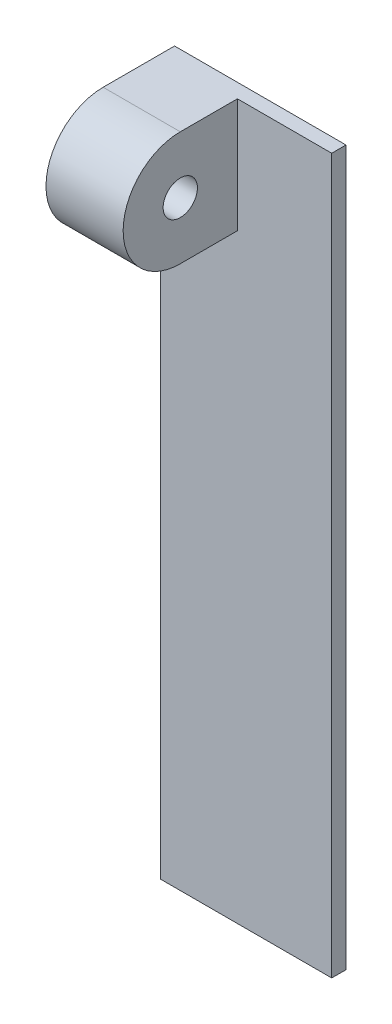
ISO-10303-21;
HEADER;
FILE_DESCRIPTION(('STEP AP214'),'2;1');
FILE_NAME('part.step','',(''),(''),'','','');
FILE_SCHEMA(('AUTOMOTIVE_DESIGN { 1 0 10303 214 1 1 1 1 }'));
ENDSEC;
DATA;
#1=APPLICATION_CONTEXT('core data for automotive mechanical design processes');
#2=APPLICATION_PROTOCOL_DEFINITION('international standard','automotive_design',2000,#1);
#3=PRODUCT_CONTEXT('',#1,'mechanical');
#4=PRODUCT('Part','Part','',(#3));
#5=PRODUCT_RELATED_PRODUCT_CATEGORY('part','',(#4));
#6=PRODUCT_DEFINITION_FORMATION('','',#4);
#7=PRODUCT_DEFINITION_CONTEXT('part definition',#1,'design');
#8=PRODUCT_DEFINITION('design','',#6,#7);
#9=PRODUCT_DEFINITION_SHAPE('','',#8);
#10=(LENGTH_UNIT() NAMED_UNIT(*) SI_UNIT(.MILLI.,.METRE.));
#11=(NAMED_UNIT(*) PLANE_ANGLE_UNIT() SI_UNIT($,.RADIAN.));
#12=(NAMED_UNIT(*) SI_UNIT($,.STERADIAN.) SOLID_ANGLE_UNIT());
#13=UNCERTAINTY_MEASURE_WITH_UNIT(LENGTH_MEASURE(1.E-05),#10,'distance_accuracy_value','');
#14=(GEOMETRIC_REPRESENTATION_CONTEXT(3) GLOBAL_UNCERTAINTY_ASSIGNED_CONTEXT((#13)) GLOBAL_UNIT_ASSIGNED_CONTEXT((#10,
#11,#12)) REPRESENTATION_CONTEXT('',''));
#15=CARTESIAN_POINT('',(0.,0.,0.));
#16=DIRECTION('',(0.,0.,1.));
#17=DIRECTION('',(1.,0.,0.));
#18=AXIS2_PLACEMENT_3D('',#15,#16,#17);
#19=CARTESIAN_POINT('',(0.,0.,5.));
#20=DIRECTION('',(0.,0.,1.));
#21=DIRECTION('',(1.,0.,0.));
#22=AXIS2_PLACEMENT_3D('',#19,#20,#21);
#23=PLANE('',#22);
#24=DIRECTION('',(-1.,0.,0.));
#25=VECTOR('',#24,1.);
#26=CARTESIAN_POINT('',(30.,125.,5.));
#27=LINE('',#26,#25);
#28=CARTESIAN_POINT('',(30.,125.,5.));
#29=VERTEX_POINT('',#28);
#30=CARTESIAN_POINT('',(-3.00000000000001,125.,5.));
#31=VERTEX_POINT('',#30);
#32=EDGE_CURVE('E121',#29,#31,#27,.T.);
#33=ORIENTED_EDGE('',*,*,#32,.T.);
#34=DIRECTION('',(0.,-1.,0.));
#35=VECTOR('',#34,1.);
#36=CARTESIAN_POINT('',(-3.00000000000001,125.,5.));
#37=LINE('',#36,#35);
#38=CARTESIAN_POINT('',(-3.00000000000001,85.,5.));
#39=VERTEX_POINT('',#38);
#40=EDGE_CURVE('E109',#31,#39,#37,.T.);
#41=ORIENTED_EDGE('',*,*,#40,.T.);
#42=DIRECTION('',(-1.,0.,0.));
#43=VECTOR('',#42,1.);
#44=CARTESIAN_POINT('',(-3.00000000000001,85.,5.));
#45=LINE('',#44,#43);
#46=CARTESIAN_POINT('',(-30.,85.,5.));
#47=VERTEX_POINT('',#46);
#48=EDGE_CURVE('E172',#39,#47,#45,.T.);
#49=ORIENTED_EDGE('',*,*,#48,.T.);
#50=DIRECTION('',(0.,-1.,0.));
#51=VECTOR('',#50,1.);
#52=CARTESIAN_POINT('',(-30.,-125.,5.));
#53=LINE('',#52,#51);
#54=CARTESIAN_POINT('',(-30.,-125.,5.));
#55=VERTEX_POINT('',#54);
#56=EDGE_CURVE('E89',#47,#55,#53,.T.);
#57=ORIENTED_EDGE('',*,*,#56,.T.);
#58=DIRECTION('',(1.,0.,0.));
#59=VECTOR('',#58,1.);
#60=CARTESIAN_POINT('',(30.,-125.,5.));
#61=LINE('',#60,#59);
#62=CARTESIAN_POINT('',(30.,-125.,5.));
#63=VERTEX_POINT('',#62);
#64=EDGE_CURVE('E134',#55,#63,#61,.T.);
#65=ORIENTED_EDGE('',*,*,#64,.T.);
#66=DIRECTION('',(0.,1.,0.));
#67=VECTOR('',#66,1.);
#68=CARTESIAN_POINT('',(30.,-125.,5.));
#69=LINE('',#68,#67);
#70=EDGE_CURVE('E64',#63,#29,#69,.T.);
#71=ORIENTED_EDGE('',*,*,#70,.T.);
#72=EDGE_LOOP('',(#33,#41,#49,#57,#65,#71));
#73=FACE_BOUND('',#72,.T.);
#74=ADVANCED_FACE('F39',(#73),#23,.T.);
#75=CARTESIAN_POINT('',(-30.,-125.,5.));
#76=DIRECTION('',(1.,0.,0.));
#77=DIRECTION('',(0.,0.,-1.));
#78=AXIS2_PLACEMENT_3D('',#75,#76,#77);
#79=PLANE('',#78);
#80=CARTESIAN_POINT('',(-30.,105.,25.));
#81=DIRECTION('',(1.,0.,0.));
#82=DIRECTION('',(0.,0.,-1.));
#83=AXIS2_PLACEMENT_3D('',#80,#81,#82);
#84=CIRCLE('',#83,6.);
#85=CARTESIAN_POINT('',(-30.,105.,19.));
#86=VERTEX_POINT('',#85);
#87=EDGE_CURVE('E274',#86,#86,#84,.T.);
#88=ORIENTED_EDGE('',*,*,#87,.T.);
#89=EDGE_LOOP('',(#88));
#90=FACE_BOUND('',#89,.T.);
#91=DIRECTION('',(0.,-1.,0.));
#92=VECTOR('',#91,1.);
#93=CARTESIAN_POINT('',(-30.,-125.,0.));
#94=LINE('',#93,#92);
#95=CARTESIAN_POINT('',(-30.,125.,0.));
#96=VERTEX_POINT('',#95);
#97=CARTESIAN_POINT('',(-30.,-125.,0.));
#98=VERTEX_POINT('',#97);
#99=EDGE_CURVE('E138',#96,#98,#94,.T.);
#100=ORIENTED_EDGE('',*,*,#99,.T.);
#101=DIRECTION('',(0.,0.,-1.));
#102=VECTOR('',#101,1.);
#103=CARTESIAN_POINT('',(-30.,-125.,5.));
#104=LINE('',#103,#102);
#105=EDGE_CURVE('E11',#55,#98,#104,.T.);
#106=ORIENTED_EDGE('',*,*,#105,.F.);
#107=ORIENTED_EDGE('',*,*,#56,.F.);
#108=DIRECTION('',(0.,0.,1.));
#109=VECTOR('',#108,1.);
#110=CARTESIAN_POINT('',(-30.,85.,5.));
#111=LINE('',#110,#109);
#112=CARTESIAN_POINT('',(-30.,85.,25.));
#113=VERTEX_POINT('',#112);
#114=EDGE_CURVE('E55',#47,#113,#111,.T.);
#115=ORIENTED_EDGE('',*,*,#114,.T.);
#116=CARTESIAN_POINT('',(-30.,105.,25.));
#117=DIRECTION('',(-1.,0.,0.));
#118=DIRECTION('',(0.,0.,-1.));
#119=AXIS2_PLACEMENT_3D('',#116,#117,#118);
#120=CIRCLE('',#119,20.);
#121=CARTESIAN_POINT('',(-30.,125.,25.));
#122=VERTEX_POINT('',#121);
#123=EDGE_CURVE('E125',#113,#122,#120,.T.);
#124=ORIENTED_EDGE('',*,*,#123,.T.);
#125=DIRECTION('',(0.,0.,-1.));
#126=VECTOR('',#125,1.);
#127=CARTESIAN_POINT('',(-30.,125.,5.));
#128=LINE('',#127,#126);
#129=EDGE_CURVE('E128',#122,#96,#128,.T.);
#130=ORIENTED_EDGE('',*,*,#129,.T.);
#131=EDGE_LOOP('',(#100,#106,#107,#115,#124,#130));
#132=FACE_BOUND('',#131,.T.);
#133=ADVANCED_FACE('F41',(#90,#132),#79,.F.);
#134=CARTESIAN_POINT('',(30.,-125.,5.));
#135=DIRECTION('',(0.,1.,0.));
#136=DIRECTION('',(-1.,0.,0.));
#137=AXIS2_PLACEMENT_3D('',#134,#135,#136);
#138=PLANE('',#137);
#139=DIRECTION('',(1.,0.,0.));
#140=VECTOR('',#139,1.);
#141=CARTESIAN_POINT('',(30.,-125.,0.));
#142=LINE('',#141,#140);
#143=CARTESIAN_POINT('',(30.,-125.,0.));
#144=VERTEX_POINT('',#143);
#145=EDGE_CURVE('E142',#98,#144,#142,.T.);
#146=ORIENTED_EDGE('',*,*,#145,.T.);
#147=DIRECTION('',(0.,0.,-1.));
#148=VECTOR('',#147,1.);
#149=CARTESIAN_POINT('',(30.,-125.,5.));
#150=LINE('',#149,#148);
#151=EDGE_CURVE('E48',#63,#144,#150,.T.);
#152=ORIENTED_EDGE('',*,*,#151,.F.);
#153=ORIENTED_EDGE('',*,*,#64,.F.);
#154=ORIENTED_EDGE('',*,*,#105,.T.);
#155=EDGE_LOOP('',(#146,#152,#153,#154));
#156=FACE_BOUND('',#155,.T.);
#157=ADVANCED_FACE('F181',(#156),#138,.F.);
#158=CARTESIAN_POINT('',(30.,-125.,5.));
#159=DIRECTION('',(-1.,0.,0.));
#160=DIRECTION('',(0.,0.,1.));
#161=AXIS2_PLACEMENT_3D('',#158,#159,#160);
#162=PLANE('',#161);
#163=DIRECTION('',(0.,1.,0.));
#164=VECTOR('',#163,1.);
#165=CARTESIAN_POINT('',(30.,-125.,0.));
#166=LINE('',#165,#164);
#167=CARTESIAN_POINT('',(30.,125.,0.));
#168=VERTEX_POINT('',#167);
#169=EDGE_CURVE('E145',#144,#168,#166,.T.);
#170=ORIENTED_EDGE('',*,*,#169,.T.);
#171=DIRECTION('',(0.,0.,-1.));
#172=VECTOR('',#171,1.);
#173=CARTESIAN_POINT('',(30.,125.,5.));
#174=LINE('',#173,#172);
#175=EDGE_CURVE('E132',#29,#168,#174,.T.);
#176=ORIENTED_EDGE('',*,*,#175,.F.);
#177=ORIENTED_EDGE('',*,*,#70,.F.);
#178=ORIENTED_EDGE('',*,*,#151,.T.);
#179=EDGE_LOOP('',(#170,#176,#177,#178));
#180=FACE_BOUND('',#179,.T.);
#181=ADVANCED_FACE('F156',(#180),#162,.F.);
#182=CARTESIAN_POINT('',(30.,125.,5.));
#183=DIRECTION('',(0.,-1.,0.));
#184=DIRECTION('',(0.,0.,-1.));
#185=AXIS2_PLACEMENT_3D('',#182,#183,#184);
#186=PLANE('',#185);
#187=DIRECTION('',(-1.,0.,0.));
#188=VECTOR('',#187,1.);
#189=CARTESIAN_POINT('',(30.,125.,0.));
#190=LINE('',#189,#188);
#191=EDGE_CURVE('E85',#168,#96,#190,.T.);
#192=ORIENTED_EDGE('',*,*,#191,.T.);
#193=ORIENTED_EDGE('',*,*,#129,.F.);
#194=DIRECTION('',(-1.,0.,0.));
#195=VECTOR('',#194,1.);
#196=CARTESIAN_POINT('',(-3.00000000000001,125.,25.));
#197=LINE('',#196,#195);
#198=CARTESIAN_POINT('',(-3.00000000000001,125.,25.));
#199=VERTEX_POINT('',#198);
#200=EDGE_CURVE('E123',#199,#122,#197,.T.);
#201=ORIENTED_EDGE('',*,*,#200,.F.);
#202=DIRECTION('',(0.,0.,-1.));
#203=VECTOR('',#202,1.);
#204=CARTESIAN_POINT('',(-3.00000000000001,125.,5.));
#205=LINE('',#204,#203);
#206=EDGE_CURVE('E113',#199,#31,#205,.T.);
#207=ORIENTED_EDGE('',*,*,#206,.T.);
#208=ORIENTED_EDGE('',*,*,#32,.F.);
#209=ORIENTED_EDGE('',*,*,#175,.T.);
#210=EDGE_LOOP('',(#192,#193,#201,#207,#208,#209));
#211=FACE_BOUND('',#210,.T.);
#212=ADVANCED_FACE('F120',(#211),#186,.F.);
#213=CARTESIAN_POINT('',(0.,0.,0.));
#214=DIRECTION('',(0.,0.,1.));
#215=DIRECTION('',(1.,0.,0.));
#216=AXIS2_PLACEMENT_3D('',#213,#214,#215);
#217=PLANE('',#216);
#218=ORIENTED_EDGE('',*,*,#99,.F.);
#219=ORIENTED_EDGE('',*,*,#191,.F.);
#220=ORIENTED_EDGE('',*,*,#169,.F.);
#221=ORIENTED_EDGE('',*,*,#145,.F.);
#222=EDGE_LOOP('',(#218,#219,#220,#221));
#223=FACE_BOUND('',#222,.T.);
#224=ADVANCED_FACE('F160',(#223),#217,.F.);
#225=CARTESIAN_POINT('',(-3.00000000000001,105.,25.));
#226=DIRECTION('',(-1.,0.,0.));
#227=DIRECTION('',(0.,0.,1.));
#228=AXIS2_PLACEMENT_3D('',#225,#226,#227);
#229=CYLINDRICAL_SURFACE('',#228,20.);
#230=ORIENTED_EDGE('',*,*,#123,.F.);
#231=DIRECTION('',(-1.,0.,0.));
#232=VECTOR('',#231,1.);
#233=CARTESIAN_POINT('',(-3.00000000000001,85.,25.));
#234=LINE('',#233,#232);
#235=CARTESIAN_POINT('',(-3.00000000000001,85.,25.));
#236=VERTEX_POINT('',#235);
#237=EDGE_CURVE('E169',#236,#113,#234,.T.);
#238=ORIENTED_EDGE('',*,*,#237,.F.);
#239=CARTESIAN_POINT('',(-3.00000000000001,105.,25.));
#240=DIRECTION('',(-1.,0.,0.));
#241=DIRECTION('',(0.,0.,-1.));
#242=AXIS2_PLACEMENT_3D('',#239,#240,#241);
#243=CIRCLE('',#242,20.);
#244=EDGE_CURVE('E167',#236,#199,#243,.T.);
#245=ORIENTED_EDGE('',*,*,#244,.T.);
#246=ORIENTED_EDGE('',*,*,#200,.T.);
#247=EDGE_LOOP('',(#230,#238,#245,#246));
#248=FACE_BOUND('',#247,.T.);
#249=ADVANCED_FACE('F166',(#248),#229,.T.);
#250=CARTESIAN_POINT('',(-3.00000000000001,85.,5.));
#251=DIRECTION('',(0.,-1.,0.));
#252=DIRECTION('',(0.,0.,-1.));
#253=AXIS2_PLACEMENT_3D('',#250,#251,#252);
#254=PLANE('',#253);
#255=ORIENTED_EDGE('',*,*,#114,.F.);
#256=ORIENTED_EDGE('',*,*,#48,.F.);
#257=DIRECTION('',(0.,0.,1.));
#258=VECTOR('',#257,1.);
#259=CARTESIAN_POINT('',(-3.00000000000001,85.,5.));
#260=LINE('',#259,#258);
#261=EDGE_CURVE('E116',#39,#236,#260,.T.);
#262=ORIENTED_EDGE('',*,*,#261,.T.);
#263=ORIENTED_EDGE('',*,*,#237,.T.);
#264=EDGE_LOOP('',(#255,#256,#262,#263));
#265=FACE_BOUND('',#264,.T.);
#266=ADVANCED_FACE('F195',(#265),#254,.T.);
#267=CARTESIAN_POINT('',(-3.00000000000001,105.,25.));
#268=DIRECTION('',(1.,0.,0.));
#269=DIRECTION('',(0.,0.,-1.));
#270=AXIS2_PLACEMENT_3D('',#267,#268,#269);
#271=PLANE('',#270);
#272=CARTESIAN_POINT('',(-3.00000000000001,105.,25.));
#273=DIRECTION('',(1.,0.,0.));
#274=DIRECTION('',(0.,0.,-1.));
#275=AXIS2_PLACEMENT_3D('',#272,#273,#274);
#276=CIRCLE('',#275,6.);
#277=CARTESIAN_POINT('',(-3.00000000000001,105.,19.));
#278=VERTEX_POINT('',#277);
#279=EDGE_CURVE('E277',#278,#278,#276,.T.);
#280=ORIENTED_EDGE('',*,*,#279,.F.);
#281=EDGE_LOOP('',(#280));
#282=FACE_BOUND('',#281,.T.);
#283=ORIENTED_EDGE('',*,*,#206,.F.);
#284=ORIENTED_EDGE('',*,*,#244,.F.);
#285=ORIENTED_EDGE('',*,*,#261,.F.);
#286=ORIENTED_EDGE('',*,*,#40,.F.);
#287=EDGE_LOOP('',(#283,#284,#285,#286));
#288=FACE_BOUND('',#287,.T.);
#289=ADVANCED_FACE('F111',(#282,#288),#271,.T.);
#290=CARTESIAN_POINT('',(-30.,105.,25.));
#291=DIRECTION('',(1.,0.,0.));
#292=DIRECTION('',(0.,0.,-1.));
#293=AXIS2_PLACEMENT_3D('',#290,#291,#292);
#294=CYLINDRICAL_SURFACE('',#293,6.);
#295=ORIENTED_EDGE('',*,*,#87,.F.);
#296=EDGE_LOOP('',(#295));
#297=FACE_BOUND('',#296,.T.);
#298=ORIENTED_EDGE('',*,*,#279,.T.);
#299=EDGE_LOOP('',(#298));
#300=FACE_BOUND('',#299,.T.);
#301=ADVANCED_FACE('F225',(#297,#300),#294,.F.);
#302=CLOSED_SHELL('',(#74,#133,#157,#181,#212,#224,#249,#266,#289,#301));
#303=MANIFOLD_SOLID_BREP('B2',#302);
#304=ADVANCED_BREP_SHAPE_REPRESENTATION('',(#18,#303),#14);
#305=SHAPE_DEFINITION_REPRESENTATION(#9,#304);
ENDSEC;
END-ISO-10303-21;
